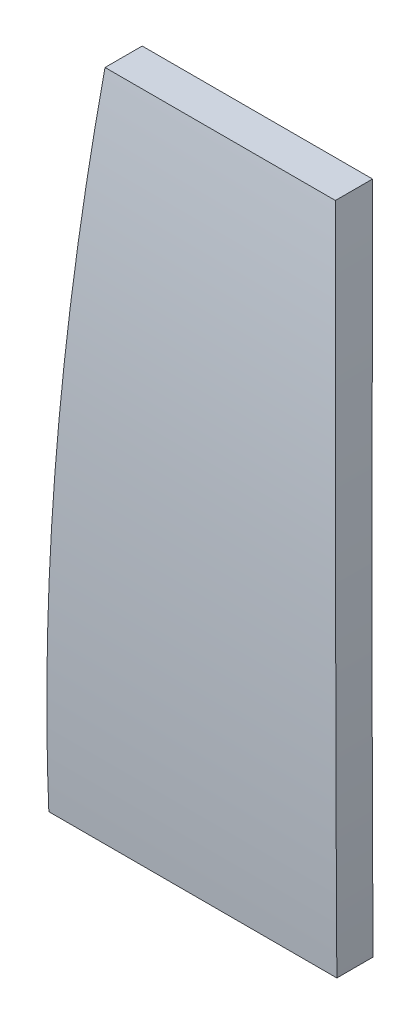
ISO-10303-21;
HEADER;
FILE_DESCRIPTION(('STEP AP214'),'2;1');
FILE_NAME('part.step','',(''),(''),'','','');
FILE_SCHEMA(('AUTOMOTIVE_DESIGN { 1 0 10303 214 1 1 1 1 }'));
ENDSEC;
DATA;
#1=APPLICATION_CONTEXT('core data for automotive mechanical design processes');
#2=APPLICATION_PROTOCOL_DEFINITION('international standard','automotive_design',2000,#1);
#3=PRODUCT_CONTEXT('',#1,'mechanical');
#4=PRODUCT('Part','Part','',(#3));
#5=PRODUCT_RELATED_PRODUCT_CATEGORY('part','',(#4));
#6=PRODUCT_DEFINITION_FORMATION('','',#4);
#7=PRODUCT_DEFINITION_CONTEXT('part definition',#1,'design');
#8=PRODUCT_DEFINITION('design','',#6,#7);
#9=PRODUCT_DEFINITION_SHAPE('','',#8);
#10=(LENGTH_UNIT() NAMED_UNIT(*) SI_UNIT(.MILLI.,.METRE.));
#11=(NAMED_UNIT(*) PLANE_ANGLE_UNIT() SI_UNIT($,.RADIAN.));
#12=(NAMED_UNIT(*) SI_UNIT($,.STERADIAN.) SOLID_ANGLE_UNIT());
#13=UNCERTAINTY_MEASURE_WITH_UNIT(LENGTH_MEASURE(1.E-05),#10,'distance_accuracy_value','');
#14=(GEOMETRIC_REPRESENTATION_CONTEXT(3) GLOBAL_UNCERTAINTY_ASSIGNED_CONTEXT((#13)) GLOBAL_UNIT_ASSIGNED_CONTEXT((#10,
#11,#12)) REPRESENTATION_CONTEXT('',''));
#15=CARTESIAN_POINT('',(0.,0.,0.));
#16=DIRECTION('',(0.,0.,1.));
#17=DIRECTION('',(1.,0.,0.));
#18=AXIS2_PLACEMENT_3D('',#15,#16,#17);
#19=CARTESIAN_POINT('',(0.,1295.4,254.));
#20=DIRECTION('',(1.,0.,0.));
#21=DIRECTION('',(0.,0.,-1.));
#22=AXIS2_PLACEMENT_3D('',#19,#20,#21);
#23=PLANE('',#22);
#24=DIRECTION('',(0.,0.,-1.));
#25=VECTOR('',#24,1.);
#26=CARTESIAN_POINT('',(0.,1295.4,254.));
#27=LINE('',#26,#25);
#28=CARTESIAN_POINT('',(0.,1295.4,-118.070312500039));
#29=VERTEX_POINT('',#28);
#30=CARTESIAN_POINT('',(0.,1295.4,-196.186778864363));
#31=VERTEX_POINT('',#30);
#32=EDGE_CURVE('E124',#29,#31,#27,.T.);
#33=ORIENTED_EDGE('',*,*,#32,.T.);
#34=CARTESIAN_POINT('',(2.22044604925031E-13,0.,-76.2671652196312));
#35=CARTESIAN_POINT('',(2.22044604925031E-13,27.5617338012193,-75.1005475507087));
#36=CARTESIAN_POINT('',(2.22044604925031E-13,68.9227960119646,-73.7058655679663));
#37=CARTESIAN_POINT('',(2.22044604925031E-13,117.209761832576,-72.7021011078366));
#38=CARTESIAN_POINT('',(2.22044604925031E-13,137.911126203236,-72.4056750356954));
#39=CARTESIAN_POINT('',(2.22044604925031E-13,151.713581328178,-72.2378018696409));
#40=CARTESIAN_POINT('',(2.22044604925031E-13,158.616910526224,-72.168728412985));
#41=CARTESIAN_POINT('',(2.22044604925031E-13,220.720840935483,-71.6812394115305));
#42=CARTESIAN_POINT('',(2.22044604925031E-13,275.713845846136,-72.2017051828809));
#43=CARTESIAN_POINT('',(2.22044604925031E-13,440.075482930528,-76.5601798781524));
#44=CARTESIAN_POINT('',(2.22044604925031E-13,548.826861796301,-83.1945610222745));
#45=CARTESIAN_POINT('',(2.22044604925031E-13,764.75559874965,-103.595446179287));
#46=CARTESIAN_POINT('',(2.22044604925031E-13,871.933032258691,-117.36202657405));
#47=CARTESIAN_POINT('',(2.22044604925031E-13,1084.78096462957,-151.72379320334));
#48=CARTESIAN_POINT('',(2.22044604925031E-13,1190.451438308,-172.319025897067));
#49=CARTESIAN_POINT('',(2.22044604925031E-13,1295.4,-196.186778864363));
#50=B_SPLINE_CURVE_WITH_KNOTS('',3,(#34,#35,#36,#37,#38,#39,#40,#41,#42,#43,#44,#45,#46,#47,#48,
#49),.UNSPECIFIED.,.F.,.F.,(4,1,1,2,2,2,2,2,4),(0.,0.0624999999999992,0.0937499999999987,
0.109374999999998,0.124999999999998,0.249999999999998,0.499999999999999,0.749999999999999,1.),.UNSPECIFIED.);
#51=CARTESIAN_POINT('',(0.,0.,-76.2671652196312));
#52=VERTEX_POINT('',#51);
#53=EDGE_CURVE('E92',#52,#31,#50,.T.);
#54=ORIENTED_EDGE('',*,*,#53,.F.);
#55=DIRECTION('',(0.,0.,-1.));
#56=VECTOR('',#55,1.);
#57=CARTESIAN_POINT('',(0.,0.,254.));
#58=LINE('',#57,#56);
#59=CARTESIAN_POINT('',(0.,0.,0.));
#60=VERTEX_POINT('',#59);
#61=EDGE_CURVE('E12',#60,#52,#58,.T.);
#62=ORIENTED_EDGE('',*,*,#61,.F.);
#63=CARTESIAN_POINT('',(2.22044604925031E-13,1295.4,-118.070312500039));
#64=CARTESIAN_POINT('',(2.22044604925031E-13,1190.44504879246,-94.5647765525138));
#65=CARTESIAN_POINT('',(2.22044604925031E-13,1084.76635823179,-74.2844503616887));
#66=CARTESIAN_POINT('',(2.22044604925031E-13,871.898428109743,-40.4506191394032));
#67=CARTESIAN_POINT('',(2.22044604925031E-13,764.709215485489,-26.8970560080185));
#68=CARTESIAN_POINT('',(2.22044604925031E-13,548.75335336974,-6.81365305422487));
#69=CARTESIAN_POINT('',(2.22044604925031E-13,439.986628438246,-0.283725014150904));
#70=CARTESIAN_POINT('',(2.22044604925031E-13,302.99708099682,3.28918840928069));
#71=CARTESIAN_POINT('',(2.22044604925031E-13,275.547604226562,3.77423759108267));
#72=CARTESIAN_POINT('',(2.22044604925031E-13,234.295160504809,4.15358594719466));
#73=CARTESIAN_POINT('',(2.22044604925031E-13,213.649381303573,4.25620261831972));
#74=CARTESIAN_POINT('',(2.22044604925031E-13,192.974099722217,4.22748653303935));
#75=CARTESIAN_POINT('',(2.22044604925031E-13,179.184003971625,4.17907373891839));
#76=CARTESIAN_POINT('',(2.22044604925031E-13,172.285212238742,4.14022328280597));
#77=CARTESIAN_POINT('',(2.22044604925031E-13,110.213970932799,3.65896252309473));
#78=CARTESIAN_POINT('',(2.22044604925031E-13,55.0845728217529,2.29519053423866));
#79=CARTESIAN_POINT('',(2.22044604925031E-13,0.,0.));
#80=B_SPLINE_CURVE_WITH_KNOTS('',3,(#63,#64,#65,#66,#67,#68,#69,#70,#71,#72,#73,#74,#75,#76,#77,
#78,#79),.UNSPECIFIED.,.F.,.F.,(4,2,2,2,2,1,2,2,4),(0.,0.25,0.5,0.749999999999999,
0.812499999999999,0.843749999999999,0.859374999999999,0.874999999999999,1.),.UNSPECIFIED.);
#81=EDGE_CURVE('E116',#29,#60,#80,.T.);
#82=ORIENTED_EDGE('',*,*,#81,.F.);
#83=EDGE_LOOP('',(#33,#54,#62,#82));
#84=FACE_BOUND('',#83,.T.);
#85=ADVANCED_FACE('F66',(#84),#23,.F.);
#86=CARTESIAN_POINT('',(0.,0.,254.));
#87=DIRECTION('',(0.,1.,0.));
#88=DIRECTION('',(0.,0.,1.));
#89=AXIS2_PLACEMENT_3D('',#86,#87,#88);
#90=PLANE('',#89);
#91=ORIENTED_EDGE('',*,*,#61,.T.);
#92=DIRECTION('',(-1.,0.,0.));
#93=VECTOR('',#92,1.);
#94=CARTESIAN_POINT('',(608.422051541168,0.,-76.2671652196312));
#95=LINE('',#94,#93);
#96=CARTESIAN_POINT('',(605.253523508979,0.,-76.2671652196312));
#97=VERTEX_POINT('',#96);
#98=EDGE_CURVE('E110',#97,#52,#95,.T.);
#99=ORIENTED_EDGE('',*,*,#98,.F.);
#100=DIRECTION('',(0.,0.,-1.));
#101=VECTOR('',#100,1.);
#102=CARTESIAN_POINT('',(605.25352350898,1.94289029309402E-13,254.));
#103=LINE('',#102,#101);
#104=CARTESIAN_POINT('',(605.253523508979,0.,0.));
#105=VERTEX_POINT('',#104);
#106=EDGE_CURVE('E76',#105,#97,#103,.T.);
#107=ORIENTED_EDGE('',*,*,#106,.F.);
#108=DIRECTION('',(-1.,0.,0.));
#109=VECTOR('',#108,1.);
#110=CARTESIAN_POINT('',(608.422051541168,0.,0.));
#111=LINE('',#110,#109);
#112=EDGE_CURVE('E128',#105,#60,#111,.T.);
#113=ORIENTED_EDGE('',*,*,#112,.T.);
#114=EDGE_LOOP('',(#91,#99,#107,#113));
#115=FACE_BOUND('',#114,.T.);
#116=ADVANCED_FACE('F127',(#115),#90,.F.);
#117=CARTESIAN_POINT('',(-4462.93645186399,179.241299896935,254.));
#118=DIRECTION('',(0.,0.,-1.));
#119=DIRECTION('',(-1.,0.,0.));
#120=AXIS2_PLACEMENT_3D('',#117,#118,#119);
#121=CYLINDRICAL_SURFACE('',#120,5071.35850340516);
#122=ORIENTED_EDGE('',*,*,#106,.T.);
#123=CARTESIAN_POINT('',(605.25352350898,1.23033817297387E-12,-76.2671652196311));
#124=CARTESIAN_POINT('',(605.741902962418,13.8091087789795,-75.6826488082601));
#125=CARTESIAN_POINT('',(606.173919164955,27.6227282003738,-75.1575464514872));
#126=CARTESIAN_POINT('',(606.925084829044,55.2570148161613,-74.2264016821669));
#127=CARTESIAN_POINT('',(607.244234548361,69.0776819943866,-73.8203589977118));
#128=CARTESIAN_POINT('',(607.769528763296,96.7241286768727,-73.1275633632695));
#129=CARTESIAN_POINT('',(607.975673463516,110.549908171832,-72.8408101973038));
#130=CARTESIAN_POINT('',(608.274870817815,138.20463878712,-72.3867396009875));
#131=CARTESIAN_POINT('',(608.3679235802,152.033589904398,-72.2194220562556));
#132=CARTESIAN_POINT('',(608.440878235596,179.688959800966,-72.0043291521527));
#133=CARTESIAN_POINT('',(608.420810888902,193.515378246365,-71.9565213000951));
#134=CARTESIAN_POINT('',(608.267589594212,221.167493423525,-71.9803713279998));
#135=CARTESIAN_POINT('',(608.134435580951,234.993190154865,-72.0520292769085));
#136=CARTESIAN_POINT('',(607.7550745817,262.641917465834,-72.3147596940284));
#137=CARTESIAN_POINT('',(607.508867432102,276.464948041574,-72.5058323350549));
#138=CARTESIAN_POINT('',(606.903474741951,304.10639973552,-73.0072707898288));
#139=CARTESIAN_POINT('',(606.54428895989,317.924820843809,-73.3176368585831));
#140=CARTESIAN_POINT('',(605.713048435735,345.555310504508,-74.057453985023));
#141=CARTESIAN_POINT('',(605.240991798962,359.367378946382,-74.4869070417522));
#142=CARTESIAN_POINT('',(604.184169994388,386.982986044347,-75.4646460397433));
#143=CARTESIAN_POINT('',(603.599404894534,400.786524705575,-76.0129319093665));
#144=CARTESIAN_POINT('',(602.317366230986,428.383088687808,-77.2280274244367));
#145=CARTESIAN_POINT('',(601.620093210417,442.176114059242,-77.8948364977218));
#146=CARTESIAN_POINT('',(600.1132808954,469.749672900847,-79.3465910548295));
#147=CARTESIAN_POINT('',(599.303742697501,483.530206491709,-80.1315353847728));
#148=CARTESIAN_POINT('',(597.572498753134,511.079757933097,-81.8192813433101));
#149=CARTESIAN_POINT('',(596.650770782919,524.848772956226,-82.7221063255467));
#150=CARTESIAN_POINT('',(594.695586794786,552.370704216607,-84.6449729089775));
#151=CARTESIAN_POINT('',(593.66213051392,566.123620415896,-85.6650147860358));
#152=CARTESIAN_POINT('',(591.483820262786,593.611751036172,-87.8217468837321));
#153=CARTESIAN_POINT('',(590.338964137019,607.346965109426,-88.9584393614892));
#154=CARTESIAN_POINT('',(587.938222494681,634.798031600932,-91.3478327710147));
#155=CARTESIAN_POINT('',(586.682333082313,648.513883322654,-92.6005377733587));
#156=CARTESIAN_POINT('',(583.317423086247,683.685457788049,-95.9632940978753));
#157=CARTESIAN_POINT('',(581.12803725918,705.12559173992,-98.1571189920204));
#158=CARTESIAN_POINT('',(576.479583451877,747.947704845682,-102.824849699402));
#159=CARTESIAN_POINT('',(574.020493737231,769.329679170211,-105.298778085631));
#160=CARTESIAN_POINT('',(568.834559305374,812.028880314714,-110.52349546919));
#161=CARTESIAN_POINT('',(566.107694648069,833.346102190801,-113.274305085101));
#162=CARTESIAN_POINT('',(560.388356760692,875.909117271996,-119.049183474377));
#163=CARTESIAN_POINT('',(557.395867123742,897.154905980648,-122.073269127411));
#164=CARTESIAN_POINT('',(551.147625977234,939.568491278752,-128.390732877226));
#165=CARTESIAN_POINT('',(547.891863540916,960.736284592955,-131.684122151133));
#166=CARTESIAN_POINT('',(541.117250936528,1003.00219570721,-138.53828440403));
#167=CARTESIAN_POINT('',(537.598214470086,1024.10025292381,-142.099246731398));
#168=CARTESIAN_POINT('',(530.301820814555,1066.2052950105,-149.482012312377));
#169=CARTESIAN_POINT('',(526.524470084092,1087.21228214366,-153.303809044347));
#170=CARTESIAN_POINT('',(518.714398135549,1129.12884606262,-161.203390142361));
#171=CARTESIAN_POINT('',(514.681694367607,1150.03842940013,-165.281157015931));
#172=CARTESIAN_POINT('',(506.364016776383,1191.75411828398,-173.687546307829));
#173=CARTESIAN_POINT('',(502.079073453215,1212.56023601252,-178.016138396076));
#174=CARTESIAN_POINT('',(495.464805365134,1243.68788944692,-184.69320070585));
#175=CARTESIAN_POINT('',(493.229109330706,1254.04929083809,-186.94937999802));
#176=CARTESIAN_POINT('',(488.695685930375,1274.74504604479,-191.522595778967));
#177=CARTESIAN_POINT('',(486.397958632796,1285.07939989008,-193.839632200714));
#178=CARTESIAN_POINT('',(484.069392709477,1295.4,-196.186778864363));
#179=B_SPLINE_CURVE_WITH_KNOTS('',3,(#123,#124,#125,#126,#127,#128,#129,#130,#131,#132,#133,
#134,#135,#136,#137,#138,#139,#140,#141,#142,#143,#144,#145,#146,#147,#148,#149,#150,#151,#152,
#153,#154,#155,#156,#157,#158,#159,#160,#161,#162,#163,#164,#165,#166,#167,#168,#169,#170,#171,
#172,#173,#174,#175,#176,#177,#178),.UNSPECIFIED.,.F.,.F.,(4,2,2,2,2,2,2,2,2,2,2,2,2,2,2,2,2,2,
2,2,2,2,2,2,2,2,2,4),(0.,41.4900596346273,82.9800245138142,124.469914273374,165.959764298763,
207.438332700377,248.916925040185,290.395577407356,331.874318441638,373.353755797402,
414.833168147198,456.312380263679,497.79118726066,539.278224235925,580.765358850908,
622.253296368422,663.742690140873,728.72786410563,793.718278830941,858.713536798968,
923.712812131073,988.714786550929,1053.76320092952,1118.80998949858,1183.85233773301,
1248.88683731663,1281.3984431983,1313.91001327142),.UNSPECIFIED.);
#180=CARTESIAN_POINT('',(484.069392709477,1295.4,-196.186778864363));
#181=VERTEX_POINT('',#180);
#182=EDGE_CURVE('E112',#97,#181,#179,.T.);
#183=ORIENTED_EDGE('',*,*,#182,.T.);
#184=DIRECTION('',(0.,0.,-1.));
#185=VECTOR('',#184,1.);
#186=CARTESIAN_POINT('',(484.069392709477,1295.4,254.));
#187=LINE('',#186,#185);
#188=CARTESIAN_POINT('',(484.069392709477,1295.4,-118.070312500039));
#189=VERTEX_POINT('',#188);
#190=EDGE_CURVE('E202',#189,#181,#187,.T.);
#191=ORIENTED_EDGE('',*,*,#190,.F.);
#192=CARTESIAN_POINT('',(484.069392709476,1295.4,-118.070312500039));
#193=CARTESIAN_POINT('',(487.039801724202,1282.23465764163,-115.121817097815));
#194=CARTESIAN_POINT('',(489.959975896964,1269.04714069903,-112.221667891094));
#195=CARTESIAN_POINT('',(495.69912858334,1242.62879237955,-106.519340335024));
#196=CARTESIAN_POINT('',(498.518105795264,1229.39796044791,-103.717163245897));
#197=CARTESIAN_POINT('',(504.054077592356,1202.89428161533,-98.212118934861));
#198=CARTESIAN_POINT('',(506.771071608721,1189.62143448051,-95.5092522668512));
#199=CARTESIAN_POINT('',(512.102315904783,1163.03505017846,-90.2041175212545));
#200=CARTESIAN_POINT('',(514.71656611155,1149.72151298237,-87.6018495150746));
#201=CARTESIAN_POINT('',(519.8416642026,1123.05466519586,-82.4990798362257));
#202=CARTESIAN_POINT('',(522.352509025564,1109.70135344044,-79.9985811764665));
#203=CARTESIAN_POINT('',(527.26999284044,1082.95672683848,-75.100640811709));
#204=CARTESIAN_POINT('',(529.676632081752,1069.56541208298,-72.7031988600608));
#205=CARTESIAN_POINT('',(534.385012367028,1042.74614270724,-68.0125303737121));
#206=CARTESIAN_POINT('',(536.68675346036,1029.31818810426,-65.7193037899657));
#207=CARTESIAN_POINT('',(541.18466890182,1002.42701464772,-61.2381781332046));
#208=CARTESIAN_POINT('',(543.380842865099,988.963795665808,-59.0502794441661));
#209=CARTESIAN_POINT('',(547.667160394278,962.002343572168,-54.7806952775554));
#210=CARTESIAN_POINT('',(549.757293948147,948.504107280213,-52.6990198291697));
#211=CARTESIAN_POINT('',(553.830677255623,921.475379196687,-48.6431757839707));
#212=CARTESIAN_POINT('',(555.81392691716,907.944887377341,-46.6690072797642));
#213=CARTESIAN_POINT('',(559.672918729351,880.853294335808,-42.8292164160845));
#214=CARTESIAN_POINT('',(561.548661581671,867.292193313998,-40.9635933481658));
#215=CARTESIAN_POINT('',(565.192048361609,840.141041036405,-37.3418754974034));
#216=CARTESIAN_POINT('',(566.959693582281,826.550990128929,-35.5857794044026));
#217=CARTESIAN_POINT('',(570.386370792709,799.343255599981,-32.1839951179511));
#218=CARTESIAN_POINT('',(572.045401655635,785.725571693337,-30.5383080699444));
#219=CARTESIAN_POINT('',(575.254308044313,758.464319266765,-27.3582225578755));
#220=CARTESIAN_POINT('',(576.804183146578,744.820750646623,-25.8238245255761));
#221=CARTESIAN_POINT('',(579.794311511426,717.509112570901,-22.8670964434464));
#222=CARTESIAN_POINT('',(581.234562002411,703.841042504796,-21.4447692270283));
#223=CARTESIAN_POINT('',(584.004994103663,676.481859499721,-18.7129127733776));
#224=CARTESIAN_POINT('',(585.335170400026,662.790745480806,-17.4033889816803));
#225=CARTESIAN_POINT('',(588.608884023068,627.607480902415,-14.1865510166852));
#226=CARTESIAN_POINT('',(590.471811608478,606.100145671811,-12.3620290199982));
#227=CARTESIAN_POINT('',(593.924471433697,563.039749956807,-8.99458151386321));
#228=CARTESIAN_POINT('',(595.514180019947,541.486685676833,-7.4516803846382));
#229=CARTESIAN_POINT('',(598.41901042706,498.342299254508,-4.64971429214485));
#230=CARTESIAN_POINT('',(599.734115827448,476.750974902125,-3.39066630211222));
#231=CARTESIAN_POINT('',(602.08858694985,433.537734150002,-1.15823484867768));
#232=CARTESIAN_POINT('',(603.127942385891,411.915816639318,-0.184862041333125));
#233=CARTESIAN_POINT('',(604.930021804675,368.649055333514,1.47485916812932));
#234=CARTESIAN_POINT('',(605.692740861719,347.00421113705,2.16120245952496));
#235=CARTESIAN_POINT('',(606.941826891982,303.667594407677,3.24665963070228));
#236=CARTESIAN_POINT('',(607.427787382046,281.975799578891,3.64535125633085));
#237=CARTESIAN_POINT('',(608.121251855713,238.584728917534,4.15322267703175));
#238=CARTESIAN_POINT('',(608.328760577174,216.885453218533,4.2624073980945));
#239=CARTESIAN_POINT('',(608.465209212024,173.48716220451,4.19109092942814));
#240=CARTESIAN_POINT('',(608.394157132615,151.788146899931,4.01059806653929));
#241=CARTESIAN_POINT('',(607.97362190043,108.397895538413,3.36013933346706));
#242=CARTESIAN_POINT('',(607.62414997833,86.7066592029982,2.89018513951587));
#243=CARTESIAN_POINT('',(606.891426568659,54.1814829887864,1.96863456381167));
#244=CARTESIAN_POINT('',(606.612440947144,43.3419330245902,1.62535737223325));
#245=CARTESIAN_POINT('',(605.985038127907,21.6673677027574,0.866715262852449));
#246=CARTESIAN_POINT('',(605.63662094155,10.8323523443789,0.451350356850451));
#247=CARTESIAN_POINT('',(605.25352350898,0.,0.));
#248=B_SPLINE_CURVE_WITH_KNOTS('',3,(#192,#193,#194,#195,#196,#197,#198,#199,#200,#201,#202,
#203,#204,#205,#206,#207,#208,#209,#210,#211,#212,#213,#214,#215,#216,#217,#218,#219,#220,#221,
#222,#223,#224,#225,#226,#227,#228,#229,#230,#231,#232,#233,#234,#235,#236,#237,#238,#239,#240,
#241,#242,#243,#244,#245,#246,#247),.UNSPECIFIED.,.F.,.F.,(4,2,2,2,2,2,2,2,2,2,2,2,2,2,2,2,2,2,
2,2,2,2,2,2,2,2,2,4),(0.,41.4436266615872,82.8877862192196,124.332176894209,165.776596986801,
207.222243161872,248.66779013787,290.113317608509,331.558996158702,373.008580636104,
414.45820081773,455.90755043902,497.356404149766,538.805687807163,580.255132264749,
621.705624325131,663.158116269527,728.148788435737,793.145084248961,858.145265539815,
923.147871114246,988.151634047419,1053.25062524993,1118.34850877915,1183.44452109017,
1248.53790774345,1281.0832248765,1313.62853668206),.UNSPECIFIED.);
#249=EDGE_CURVE('E84',#189,#105,#248,.T.);
#250=ORIENTED_EDGE('',*,*,#249,.T.);
#251=EDGE_LOOP('',(#122,#183,#191,#250));
#252=FACE_BOUND('',#251,.T.);
#253=ADVANCED_FACE('F189',(#252),#121,.T.);
#254=CARTESIAN_POINT('',(0.,1295.4,254.));
#255=DIRECTION('',(0.,-1.,0.));
#256=DIRECTION('',(0.,0.,-1.));
#257=AXIS2_PLACEMENT_3D('',#254,#255,#256);
#258=PLANE('',#257);
#259=ORIENTED_EDGE('',*,*,#190,.T.);
#260=DIRECTION('',(-1.,0.,0.));
#261=VECTOR('',#260,1.);
#262=CARTESIAN_POINT('',(608.422051541168,1295.4,-196.186778864363));
#263=LINE('',#262,#261);
#264=EDGE_CURVE('E117',#181,#31,#263,.T.);
#265=ORIENTED_EDGE('',*,*,#264,.T.);
#266=ORIENTED_EDGE('',*,*,#32,.F.);
#267=DIRECTION('',(-1.,0.,0.));
#268=VECTOR('',#267,1.);
#269=CARTESIAN_POINT('',(608.422051541168,1295.4,-118.070312500039));
#270=LINE('',#269,#268);
#271=EDGE_CURVE('E129',#189,#29,#270,.T.);
#272=ORIENTED_EDGE('',*,*,#271,.F.);
#273=EDGE_LOOP('',(#259,#265,#266,#272));
#274=FACE_BOUND('',#273,.T.);
#275=ADVANCED_FACE('F156',(#274),#258,.F.);
#276=CARTESIAN_POINT('',(608.422051541168,1295.4,-118.070312500039));
#277=CARTESIAN_POINT('',(608.422051541168,1190.44504879246,-94.5647765525138));
#278=CARTESIAN_POINT('',(608.422051541168,1084.76635823179,-74.2844503616887));
#279=CARTESIAN_POINT('',(608.422051541168,871.898428109743,-40.4506191394032));
#280=CARTESIAN_POINT('',(608.422051541168,764.709215485489,-26.8970560080185));
#281=CARTESIAN_POINT('',(608.422051541168,548.75335336974,-6.81365305422487));
#282=CARTESIAN_POINT('',(608.422051541168,439.986628438246,-0.283725014150904));
#283=CARTESIAN_POINT('',(608.422051541168,302.99708099682,3.28918840928069));
#284=CARTESIAN_POINT('',(608.422051541168,275.547604226562,3.77423759108267));
#285=CARTESIAN_POINT('',(608.422051541168,234.295160504809,4.15358594719466));
#286=CARTESIAN_POINT('',(608.422051541168,213.649381303573,4.25620261831972));
#287=CARTESIAN_POINT('',(608.422051541168,192.974099722217,4.22748653303935));
#288=CARTESIAN_POINT('',(608.422051541168,179.184003971625,4.17907373891839));
#289=CARTESIAN_POINT('',(608.422051541168,172.285212238742,4.14022328280597));
#290=CARTESIAN_POINT('',(608.422051541168,110.213970932799,3.65896252309473));
#291=CARTESIAN_POINT('',(608.422051541168,55.0845728217529,2.29519053423866));
#292=CARTESIAN_POINT('',(608.422051541168,0.,0.));
#293=B_SPLINE_CURVE_WITH_KNOTS('',3,(#276,#277,#278,#279,#280,#281,#282,#283,#284,#285,#286,
#287,#288,#289,#290,#291,#292),.UNSPECIFIED.,.F.,.F.,(4,2,2,2,2,1,2,2,4),(0.,0.25,0.5,
0.749999999999999,0.812499999999999,0.843749999999999,0.859374999999999,0.874999999999999,1.),.UNSPECIFIED.);
#294=DIRECTION('',(-1.,0.,0.));
#295=VECTOR('',#294,1.);
#296=SURFACE_OF_LINEAR_EXTRUSION('',#293,#295);
#297=ORIENTED_EDGE('',*,*,#271,.T.);
#298=ORIENTED_EDGE('',*,*,#81,.T.);
#299=ORIENTED_EDGE('',*,*,#112,.F.);
#300=ORIENTED_EDGE('',*,*,#249,.F.);
#301=EDGE_LOOP('',(#297,#298,#299,#300));
#302=FACE_BOUND('',#301,.T.);
#303=ADVANCED_FACE('F146',(#302),#296,.F.);
#304=CARTESIAN_POINT('',(608.422051541168,0.,-76.2671652196312));
#305=CARTESIAN_POINT('',(608.422051541168,27.5617338012193,-75.1005475507087));
#306=CARTESIAN_POINT('',(608.422051541168,68.9227960119646,-73.7058655679663));
#307=CARTESIAN_POINT('',(608.422051541168,117.209761832576,-72.7021011078366));
#308=CARTESIAN_POINT('',(608.422051541168,137.911126203236,-72.4056750356954));
#309=CARTESIAN_POINT('',(608.422051541168,151.713581328178,-72.2378018696409));
#310=CARTESIAN_POINT('',(608.422051541168,158.616910526224,-72.168728412985));
#311=CARTESIAN_POINT('',(608.422051541168,220.720840935483,-71.6812394115305));
#312=CARTESIAN_POINT('',(608.422051541168,275.713845846136,-72.2017051828809));
#313=CARTESIAN_POINT('',(608.422051541168,440.075482930528,-76.5601798781524));
#314=CARTESIAN_POINT('',(608.422051541168,548.826861796301,-83.1945610222745));
#315=CARTESIAN_POINT('',(608.422051541168,764.75559874965,-103.595446179287));
#316=CARTESIAN_POINT('',(608.422051541168,871.933032258691,-117.36202657405));
#317=CARTESIAN_POINT('',(608.422051541168,1084.78096462957,-151.72379320334));
#318=CARTESIAN_POINT('',(608.422051541168,1190.451438308,-172.319025897067));
#319=CARTESIAN_POINT('',(608.422051541168,1295.4,-196.186778864363));
#320=B_SPLINE_CURVE_WITH_KNOTS('',3,(#304,#305,#306,#307,#308,#309,#310,#311,#312,#313,#314,
#315,#316,#317,#318,#319),.UNSPECIFIED.,.F.,.F.,(4,1,1,2,2,2,2,2,4),(0.,0.0624999999999992,
0.0937499999999987,0.109374999999998,0.124999999999998,0.249999999999998,0.499999999999999,
0.749999999999999,1.),.UNSPECIFIED.);
#321=DIRECTION('',(-1.,0.,0.));
#322=VECTOR('',#321,1.);
#323=SURFACE_OF_LINEAR_EXTRUSION('',#320,#322);
#324=ORIENTED_EDGE('',*,*,#98,.T.);
#325=ORIENTED_EDGE('',*,*,#53,.T.);
#326=ORIENTED_EDGE('',*,*,#264,.F.);
#327=ORIENTED_EDGE('',*,*,#182,.F.);
#328=EDGE_LOOP('',(#324,#325,#326,#327));
#329=FACE_BOUND('',#328,.T.);
#330=ADVANCED_FACE('F111',(#329),#323,.F.);
#331=CLOSED_SHELL('',(#85,#116,#253,#275,#303,#330));
#332=MANIFOLD_SOLID_BREP('B2',#331);
#333=ADVANCED_BREP_SHAPE_REPRESENTATION('',(#18,#332),#14);
#334=SHAPE_DEFINITION_REPRESENTATION(#9,#333);
ENDSEC;
END-ISO-10303-21;
